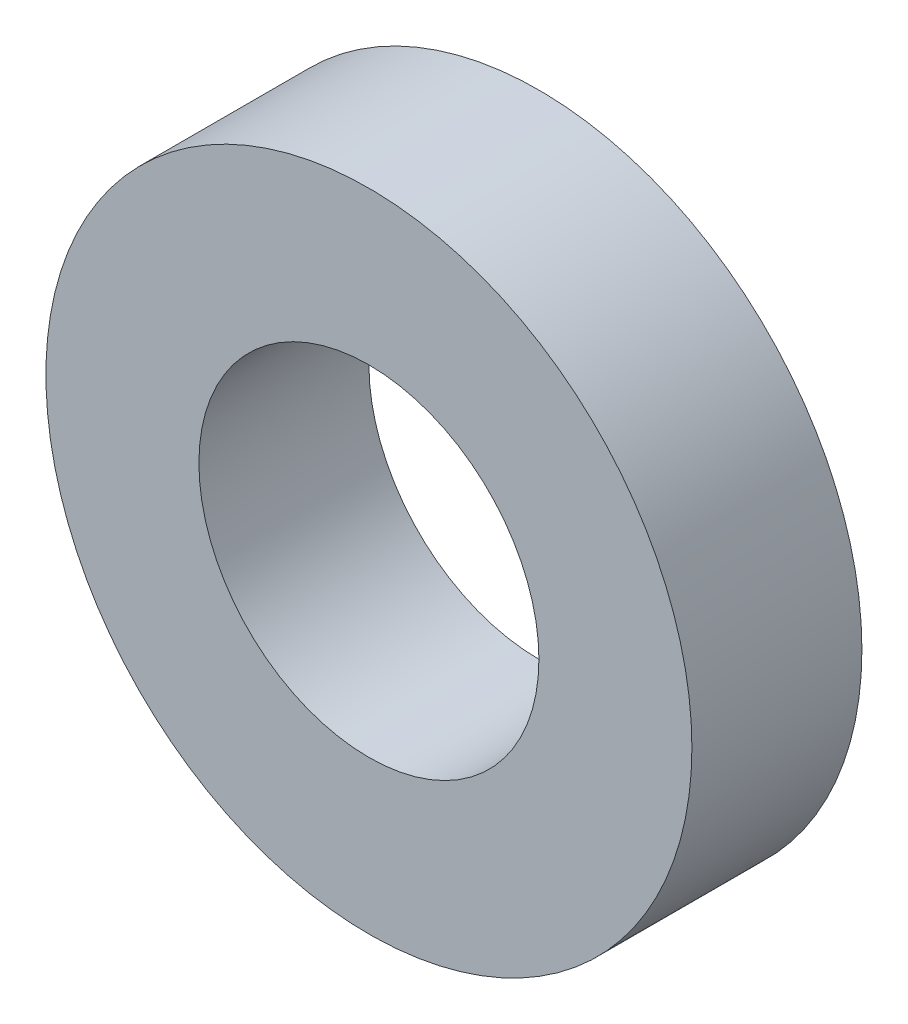
ISO-10303-21;
HEADER;
FILE_DESCRIPTION(('STEP AP214'),'2;1');
FILE_NAME('part.step','',(''),(''),'','','');
FILE_SCHEMA(('AUTOMOTIVE_DESIGN { 1 0 10303 214 1 1 1 1 }'));
ENDSEC;
DATA;
#1=APPLICATION_CONTEXT('core data for automotive mechanical design processes');
#2=APPLICATION_PROTOCOL_DEFINITION('international standard','automotive_design',2000,#1);
#3=PRODUCT_CONTEXT('',#1,'mechanical');
#4=PRODUCT('Part','Part','',(#3));
#5=PRODUCT_RELATED_PRODUCT_CATEGORY('part','',(#4));
#6=PRODUCT_DEFINITION_FORMATION('','',#4);
#7=PRODUCT_DEFINITION_CONTEXT('part definition',#1,'design');
#8=PRODUCT_DEFINITION('design','',#6,#7);
#9=PRODUCT_DEFINITION_SHAPE('','',#8);
#10=(LENGTH_UNIT() NAMED_UNIT(*) SI_UNIT(.MILLI.,.METRE.));
#11=(NAMED_UNIT(*) PLANE_ANGLE_UNIT() SI_UNIT($,.RADIAN.));
#12=(NAMED_UNIT(*) SI_UNIT($,.STERADIAN.) SOLID_ANGLE_UNIT());
#13=UNCERTAINTY_MEASURE_WITH_UNIT(LENGTH_MEASURE(1.E-05),#10,'distance_accuracy_value','');
#14=(GEOMETRIC_REPRESENTATION_CONTEXT(3) GLOBAL_UNCERTAINTY_ASSIGNED_CONTEXT((#13)) GLOBAL_UNIT_ASSIGNED_CONTEXT((#10,
#11,#12)) REPRESENTATION_CONTEXT('',''));
#15=CARTESIAN_POINT('',(0.,0.,0.));
#16=DIRECTION('',(0.,0.,1.));
#17=DIRECTION('',(1.,0.,0.));
#18=AXIS2_PLACEMENT_3D('',#15,#16,#17);
#19=CARTESIAN_POINT('',(0.,0.,5.));
#20=DIRECTION('',(0.,0.,1.));
#21=DIRECTION('',(1.,0.,0.));
#22=AXIS2_PLACEMENT_3D('',#19,#20,#21);
#23=PLANE('',#22);
#24=CARTESIAN_POINT('',(0.,0.,5.));
#25=DIRECTION('',(0.,0.,1.));
#26=DIRECTION('',(1.,0.,0.));
#27=AXIS2_PLACEMENT_3D('',#24,#25,#26);
#28=CIRCLE('',#27,9.5);
#29=CARTESIAN_POINT('',(9.5,0.,5.));
#30=VERTEX_POINT('',#29);
#31=EDGE_CURVE('E10',#30,#30,#28,.T.);
#32=ORIENTED_EDGE('',*,*,#31,.T.);
#33=EDGE_LOOP('',(#32));
#34=FACE_BOUND('',#33,.T.);
#35=CARTESIAN_POINT('',(0.,0.,5.));
#36=DIRECTION('',(0.,0.,1.));
#37=DIRECTION('',(1.,0.,0.));
#38=AXIS2_PLACEMENT_3D('',#35,#36,#37);
#39=CIRCLE('',#38,5.);
#40=CARTESIAN_POINT('',(5.,0.,5.));
#41=VERTEX_POINT('',#40);
#42=EDGE_CURVE('E42',#41,#41,#39,.T.);
#43=ORIENTED_EDGE('',*,*,#42,.F.);
#44=EDGE_LOOP('',(#43));
#45=FACE_BOUND('',#44,.T.);
#46=ADVANCED_FACE('F31',(#34,#45),#23,.T.);
#47=CARTESIAN_POINT('',(0.,0.,0.));
#48=DIRECTION('',(0.,0.,1.));
#49=DIRECTION('',(1.,0.,0.));
#50=AXIS2_PLACEMENT_3D('',#47,#48,#49);
#51=PLANE('',#50);
#52=CARTESIAN_POINT('',(0.,0.,0.));
#53=DIRECTION('',(0.,0.,1.));
#54=DIRECTION('',(1.,0.,0.));
#55=AXIS2_PLACEMENT_3D('',#52,#53,#54);
#56=CIRCLE('',#55,9.5);
#57=CARTESIAN_POINT('',(9.5,0.,0.));
#58=VERTEX_POINT('',#57);
#59=EDGE_CURVE('E35',#58,#58,#56,.T.);
#60=ORIENTED_EDGE('',*,*,#59,.F.);
#61=EDGE_LOOP('',(#60));
#62=FACE_BOUND('',#61,.T.);
#63=CARTESIAN_POINT('',(0.,0.,0.));
#64=DIRECTION('',(0.,0.,1.));
#65=DIRECTION('',(1.,0.,0.));
#66=AXIS2_PLACEMENT_3D('',#63,#64,#65);
#67=CIRCLE('',#66,5.);
#68=CARTESIAN_POINT('',(5.,0.,0.));
#69=VERTEX_POINT('',#68);
#70=EDGE_CURVE('E44',#69,#69,#67,.T.);
#71=ORIENTED_EDGE('',*,*,#70,.T.);
#72=EDGE_LOOP('',(#71));
#73=FACE_BOUND('',#72,.T.);
#74=ADVANCED_FACE('F54',(#62,#73),#51,.F.);
#75=CARTESIAN_POINT('',(0.,0.,5.));
#76=DIRECTION('',(0.,0.,-1.));
#77=DIRECTION('',(-1.,0.,0.));
#78=AXIS2_PLACEMENT_3D('',#75,#76,#77);
#79=CYLINDRICAL_SURFACE('',#78,9.5);
#80=ORIENTED_EDGE('',*,*,#31,.F.);
#81=EDGE_LOOP('',(#80));
#82=FACE_BOUND('',#81,.T.);
#83=ORIENTED_EDGE('',*,*,#59,.T.);
#84=EDGE_LOOP('',(#83));
#85=FACE_BOUND('',#84,.T.);
#86=ADVANCED_FACE('F33',(#82,#85),#79,.T.);
#87=CARTESIAN_POINT('',(0.,0.,5.));
#88=DIRECTION('',(0.,0.,-1.));
#89=DIRECTION('',(-1.,0.,0.));
#90=AXIS2_PLACEMENT_3D('',#87,#88,#89);
#91=CYLINDRICAL_SURFACE('',#90,5.);
#92=ORIENTED_EDGE('',*,*,#42,.T.);
#93=EDGE_LOOP('',(#92));
#94=FACE_BOUND('',#93,.T.);
#95=ORIENTED_EDGE('',*,*,#70,.F.);
#96=EDGE_LOOP('',(#95));
#97=FACE_BOUND('',#96,.T.);
#98=ADVANCED_FACE('F50',(#94,#97),#91,.F.);
#99=CLOSED_SHELL('',(#46,#74,#86,#98));
#100=MANIFOLD_SOLID_BREP('B2',#99);
#101=ADVANCED_BREP_SHAPE_REPRESENTATION('',(#18,#100),#14);
#102=SHAPE_DEFINITION_REPRESENTATION(#9,#101);
ENDSEC;
END-ISO-10303-21;
